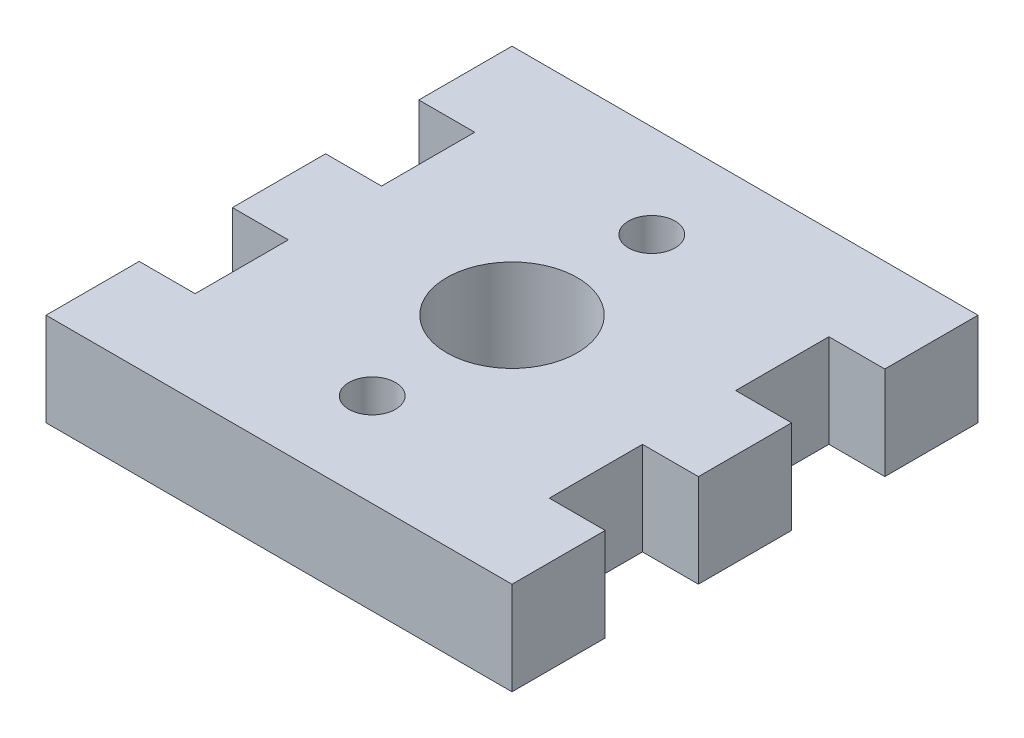
ISO-10303-21;
HEADER;
FILE_DESCRIPTION(('STEP AP214'),'2;1');
FILE_NAME('part.step','',(''),(''),'','','');
FILE_SCHEMA(('AUTOMOTIVE_DESIGN { 1 0 10303 214 1 1 1 1 }'));
ENDSEC;
DATA;
#1=APPLICATION_CONTEXT('core data for automotive mechanical design processes');
#2=APPLICATION_PROTOCOL_DEFINITION('international standard','automotive_design',2000,#1);
#3=PRODUCT_CONTEXT('',#1,'mechanical');
#4=PRODUCT('Part','Part','',(#3));
#5=PRODUCT_RELATED_PRODUCT_CATEGORY('part','',(#4));
#6=PRODUCT_DEFINITION_FORMATION('','',#4);
#7=PRODUCT_DEFINITION_CONTEXT('part definition',#1,'design');
#8=PRODUCT_DEFINITION('design','',#6,#7);
#9=PRODUCT_DEFINITION_SHAPE('','',#8);
#10=(LENGTH_UNIT() NAMED_UNIT(*) SI_UNIT(.MILLI.,.METRE.));
#11=(NAMED_UNIT(*) PLANE_ANGLE_UNIT() SI_UNIT($,.RADIAN.));
#12=(NAMED_UNIT(*) SI_UNIT($,.STERADIAN.) SOLID_ANGLE_UNIT());
#13=UNCERTAINTY_MEASURE_WITH_UNIT(LENGTH_MEASURE(1.E-05),#10,'distance_accuracy_value','');
#14=(GEOMETRIC_REPRESENTATION_CONTEXT(3) GLOBAL_UNCERTAINTY_ASSIGNED_CONTEXT((#13)) GLOBAL_UNIT_ASSIGNED_CONTEXT((#10,
#11,#12)) REPRESENTATION_CONTEXT('',''));
#15=CARTESIAN_POINT('',(0.,0.,0.));
#16=DIRECTION('',(0.,0.,1.));
#17=DIRECTION('',(1.,0.,0.));
#18=AXIS2_PLACEMENT_3D('',#15,#16,#17);
#19=CARTESIAN_POINT('',(0.,5.,0.));
#20=DIRECTION('',(0.,-1.,0.));
#21=DIRECTION('',(0.,0.,-1.));
#22=AXIS2_PLACEMENT_3D('',#19,#20,#21);
#23=PLANE('',#22);
#24=CARTESIAN_POINT('',(1.34297520661155,5.,-5.64049586776859));
#25=DIRECTION('',(0.,1.,0.));
#26=DIRECTION('',(0.,0.,1.));
#27=AXIS2_PLACEMENT_3D('',#24,#25,#26);
#28=CIRCLE('',#27,1.25);
#29=CARTESIAN_POINT('',(1.34297520661155,5.,-4.39049586776859));
#30=VERTEX_POINT('',#29);
#31=EDGE_CURVE('E501',#30,#30,#28,.T.);
#32=ORIENTED_EDGE('',*,*,#31,.F.);
#33=EDGE_LOOP('',(#32));
#34=FACE_BOUND('',#33,.T.);
#35=CARTESIAN_POINT('',(1.34297520661155,5.,9.35950413223141));
#36=DIRECTION('',(0.,1.,0.));
#37=DIRECTION('',(0.,0.,1.));
#38=AXIS2_PLACEMENT_3D('',#35,#36,#37);
#39=CIRCLE('',#38,1.25);
#40=CARTESIAN_POINT('',(1.34297520661155,5.,10.6095041322314));
#41=VERTEX_POINT('',#40);
#42=EDGE_CURVE('E493',#41,#41,#39,.T.);
#43=ORIENTED_EDGE('',*,*,#42,.F.);
#44=EDGE_LOOP('',(#43));
#45=FACE_BOUND('',#44,.T.);
#46=CARTESIAN_POINT('',(1.34297520661155,5.,1.85950413223141));
#47=DIRECTION('',(0.,1.,0.));
#48=DIRECTION('',(0.,0.,1.));
#49=AXIS2_PLACEMENT_3D('',#46,#47,#48);
#50=CIRCLE('',#49,3.5);
#51=CARTESIAN_POINT('',(1.34297520661155,5.,5.35950413223141));
#52=VERTEX_POINT('',#51);
#53=EDGE_CURVE('E384',#52,#52,#50,.T.);
#54=ORIENTED_EDGE('',*,*,#53,.F.);
#55=EDGE_LOOP('',(#54));
#56=FACE_BOUND('',#55,.T.);
#57=DIRECTION('',(-1.,0.,0.));
#58=VECTOR('',#57,1.);
#59=CARTESIAN_POINT('',(13.8429752066116,5.,-0.640495867768589));
#60=LINE('',#59,#58);
#61=CARTESIAN_POINT('',(13.8429752066116,5.,-0.640495867768589));
#62=VERTEX_POINT('',#61);
#63=CARTESIAN_POINT('',(10.8429752066116,5.,-0.640495867768589));
#64=VERTEX_POINT('',#63);
#65=EDGE_CURVE('E314',#62,#64,#60,.T.);
#66=ORIENTED_EDGE('',*,*,#65,.T.);
#67=DIRECTION('',(0.,0.,1.));
#68=VECTOR('',#67,1.);
#69=CARTESIAN_POINT('',(10.8429752066116,5.,-5.64049586776859));
#70=LINE('',#69,#68);
#71=CARTESIAN_POINT('',(10.8429752066116,5.,-5.64049586776859));
#72=VERTEX_POINT('',#71);
#73=EDGE_CURVE('E336',#72,#64,#70,.T.);
#74=ORIENTED_EDGE('',*,*,#73,.F.);
#75=DIRECTION('',(-1.,0.,0.));
#76=VECTOR('',#75,1.);
#77=CARTESIAN_POINT('',(13.8429752066116,5.,-5.64049586776859));
#78=LINE('',#77,#76);
#79=CARTESIAN_POINT('',(13.8429752066116,5.,-5.64049586776859));
#80=VERTEX_POINT('',#79);
#81=EDGE_CURVE('E332',#80,#72,#78,.T.);
#82=ORIENTED_EDGE('',*,*,#81,.F.);
#83=DIRECTION('',(0.,0.,-1.));
#84=VECTOR('',#83,1.);
#85=CARTESIAN_POINT('',(13.8429752066116,5.,14.3595041322314));
#86=LINE('',#85,#84);
#87=CARTESIAN_POINT('',(13.8429752066116,5.,-10.6404958677686));
#88=VERTEX_POINT('',#87);
#89=EDGE_CURVE('E216',#80,#88,#86,.T.);
#90=ORIENTED_EDGE('',*,*,#89,.T.);
#91=DIRECTION('',(-1.,0.,0.));
#92=VECTOR('',#91,1.);
#93=CARTESIAN_POINT('',(-11.1570247933884,5.,-10.6404958677686));
#94=LINE('',#93,#92);
#95=CARTESIAN_POINT('',(-11.1570247933884,5.,-10.6404958677686));
#96=VERTEX_POINT('',#95);
#97=EDGE_CURVE('E225',#88,#96,#94,.T.);
#98=ORIENTED_EDGE('',*,*,#97,.T.);
#99=DIRECTION('',(0.,0.,1.));
#100=VECTOR('',#99,1.);
#101=CARTESIAN_POINT('',(-11.1570247933884,5.,14.3595041322314));
#102=LINE('',#101,#100);
#103=CARTESIAN_POINT('',(-11.1570247933884,5.,-5.64049586776859));
#104=VERTEX_POINT('',#103);
#105=EDGE_CURVE('E203',#96,#104,#102,.T.);
#106=ORIENTED_EDGE('',*,*,#105,.T.);
#107=DIRECTION('',(1.,0.,0.));
#108=VECTOR('',#107,1.);
#109=CARTESIAN_POINT('',(-11.1570247933884,5.,-5.64049586776859));
#110=LINE('',#109,#108);
#111=CARTESIAN_POINT('',(-8.15702479338845,5.,-5.64049586776859));
#112=VERTEX_POINT('',#111);
#113=EDGE_CURVE('E54',#104,#112,#110,.T.);
#114=ORIENTED_EDGE('',*,*,#113,.T.);
#115=DIRECTION('',(0.,0.,1.));
#116=VECTOR('',#115,1.);
#117=CARTESIAN_POINT('',(-8.15702479338845,5.,-5.64049586776859));
#118=LINE('',#117,#116);
#119=CARTESIAN_POINT('',(-8.15702479338845,5.,-0.640495867768589));
#120=VERTEX_POINT('',#119);
#121=EDGE_CURVE('E346',#112,#120,#118,.T.);
#122=ORIENTED_EDGE('',*,*,#121,.T.);
#123=DIRECTION('',(1.,0.,0.));
#124=VECTOR('',#123,1.);
#125=CARTESIAN_POINT('',(-11.1570247933884,5.,-0.640495867768589));
#126=LINE('',#125,#124);
#127=CARTESIAN_POINT('',(-11.1570247933884,5.,-0.640495867768589));
#128=VERTEX_POINT('',#127);
#129=EDGE_CURVE('E342',#128,#120,#126,.T.);
#130=ORIENTED_EDGE('',*,*,#129,.F.);
#131=CARTESIAN_POINT('',(-11.1570247933884,5.,4.35950413223141));
#132=VERTEX_POINT('',#131);
#133=EDGE_CURVE('E200',#128,#132,#102,.T.);
#134=ORIENTED_EDGE('',*,*,#133,.T.);
#135=DIRECTION('',(1.,0.,0.));
#136=VECTOR('',#135,1.);
#137=CARTESIAN_POINT('',(-11.1570247933884,5.,4.35950413223141));
#138=LINE('',#137,#136);
#139=CARTESIAN_POINT('',(-8.15702479338845,5.,4.35950413223141));
#140=VERTEX_POINT('',#139);
#141=EDGE_CURVE('E347',#132,#140,#138,.T.);
#142=ORIENTED_EDGE('',*,*,#141,.T.);
#143=DIRECTION('',(0.,0.,-1.));
#144=VECTOR('',#143,1.);
#145=CARTESIAN_POINT('',(-8.15702479338845,5.,9.35950413223141));
#146=LINE('',#145,#144);
#147=CARTESIAN_POINT('',(-8.15702479338845,5.,9.35950413223141));
#148=VERTEX_POINT('',#147);
#149=EDGE_CURVE('E192',#148,#140,#146,.T.);
#150=ORIENTED_EDGE('',*,*,#149,.F.);
#151=DIRECTION('',(1.,0.,0.));
#152=VECTOR('',#151,1.);
#153=CARTESIAN_POINT('',(-11.1570247933884,5.,9.35950413223141));
#154=LINE('',#153,#152);
#155=CARTESIAN_POINT('',(-11.1570247933884,5.,9.35950413223141));
#156=VERTEX_POINT('',#155);
#157=EDGE_CURVE('E177',#156,#148,#154,.T.);
#158=ORIENTED_EDGE('',*,*,#157,.F.);
#159=CARTESIAN_POINT('',(-11.1570247933884,5.,14.3595041322314));
#160=VERTEX_POINT('',#159);
#161=EDGE_CURVE('E188',#156,#160,#102,.T.);
#162=ORIENTED_EDGE('',*,*,#161,.T.);
#163=DIRECTION('',(1.,0.,0.));
#164=VECTOR('',#163,1.);
#165=CARTESIAN_POINT('',(-11.1570247933884,5.,14.3595041322314));
#166=LINE('',#165,#164);
#167=CARTESIAN_POINT('',(13.8429752066116,5.,14.3595041322314));
#168=VERTEX_POINT('',#167);
#169=EDGE_CURVE('E213',#160,#168,#166,.T.);
#170=ORIENTED_EDGE('',*,*,#169,.T.);
#171=CARTESIAN_POINT('',(13.8429752066116,5.,9.35950413223141));
#172=VERTEX_POINT('',#171);
#173=EDGE_CURVE('E222',#168,#172,#86,.T.);
#174=ORIENTED_EDGE('',*,*,#173,.T.);
#175=DIRECTION('',(-1.,0.,0.));
#176=VECTOR('',#175,1.);
#177=CARTESIAN_POINT('',(13.8429752066116,5.,9.35950413223141));
#178=LINE('',#177,#176);
#179=CARTESIAN_POINT('',(10.8429752066116,5.,9.35950413223141));
#180=VERTEX_POINT('',#179);
#181=EDGE_CURVE('E320',#172,#180,#178,.T.);
#182=ORIENTED_EDGE('',*,*,#181,.T.);
#183=DIRECTION('',(0.,0.,-1.));
#184=VECTOR('',#183,1.);
#185=CARTESIAN_POINT('',(10.8429752066116,5.,9.35950413223141));
#186=LINE('',#185,#184);
#187=CARTESIAN_POINT('',(10.8429752066116,5.,4.35950413223141));
#188=VERTEX_POINT('',#187);
#189=EDGE_CURVE('E312',#180,#188,#186,.T.);
#190=ORIENTED_EDGE('',*,*,#189,.T.);
#191=DIRECTION('',(-1.,0.,0.));
#192=VECTOR('',#191,1.);
#193=CARTESIAN_POINT('',(13.8429752066116,5.,4.35950413223141));
#194=LINE('',#193,#192);
#195=CARTESIAN_POINT('',(13.8429752066116,5.,4.35950413223141));
#196=VERTEX_POINT('',#195);
#197=EDGE_CURVE('E306',#196,#188,#194,.T.);
#198=ORIENTED_EDGE('',*,*,#197,.F.);
#199=EDGE_CURVE('E220',#196,#62,#86,.T.);
#200=ORIENTED_EDGE('',*,*,#199,.T.);
#201=EDGE_LOOP('',(#66,#74,#82,#90,#98,#106,#114,#122,#130,#134,#142,#150,#158,#162,#170,#174,
#182,#190,#198,#200));
#202=FACE_BOUND('',#201,.T.);
#203=ADVANCED_FACE('F38',(#34,#45,#56,#202),#23,.F.);
#204=CARTESIAN_POINT('',(0.,0.,0.));
#205=DIRECTION('',(0.,-1.,0.));
#206=DIRECTION('',(0.,0.,-1.));
#207=AXIS2_PLACEMENT_3D('',#204,#205,#206);
#208=PLANE('',#207);
#209=CARTESIAN_POINT('',(1.34297520661155,0.,-5.64049586776859));
#210=DIRECTION('',(0.,1.,0.));
#211=DIRECTION('',(0.,0.,1.));
#212=AXIS2_PLACEMENT_3D('',#209,#210,#211);
#213=CIRCLE('',#212,1.25);
#214=CARTESIAN_POINT('',(1.34297520661155,0.,-4.39049586776859));
#215=VERTEX_POINT('',#214);
#216=EDGE_CURVE('E329',#215,#215,#213,.T.);
#217=ORIENTED_EDGE('',*,*,#216,.T.);
#218=EDGE_LOOP('',(#217));
#219=FACE_BOUND('',#218,.T.);
#220=CARTESIAN_POINT('',(1.34297520661155,0.,9.35950413223141));
#221=DIRECTION('',(0.,1.,0.));
#222=DIRECTION('',(0.,0.,1.));
#223=AXIS2_PLACEMENT_3D('',#220,#221,#222);
#224=CIRCLE('',#223,1.25);
#225=CARTESIAN_POINT('',(1.34297520661155,0.,10.6095041322314));
#226=VERTEX_POINT('',#225);
#227=EDGE_CURVE('E497',#226,#226,#224,.T.);
#228=ORIENTED_EDGE('',*,*,#227,.T.);
#229=EDGE_LOOP('',(#228));
#230=FACE_BOUND('',#229,.T.);
#231=CARTESIAN_POINT('',(1.34297520661155,0.,1.85950413223141));
#232=DIRECTION('',(0.,1.,0.));
#233=DIRECTION('',(0.,0.,1.));
#234=AXIS2_PLACEMENT_3D('',#231,#232,#233);
#235=CIRCLE('',#234,3.5);
#236=CARTESIAN_POINT('',(1.34297520661155,0.,5.35950413223141));
#237=VERTEX_POINT('',#236);
#238=EDGE_CURVE('E383',#237,#237,#235,.T.);
#239=ORIENTED_EDGE('',*,*,#238,.T.);
#240=EDGE_LOOP('',(#239));
#241=FACE_BOUND('',#240,.T.);
#242=DIRECTION('',(0.,0.,-1.));
#243=VECTOR('',#242,1.);
#244=CARTESIAN_POINT('',(10.8429752066116,0.,0.));
#245=LINE('',#244,#243);
#246=CARTESIAN_POINT('',(10.8429752066116,0.,-0.640495867768589));
#247=VERTEX_POINT('',#246);
#248=CARTESIAN_POINT('',(10.8429752066116,0.,-5.64049586776859));
#249=VERTEX_POINT('',#248);
#250=EDGE_CURVE('E11',#247,#249,#245,.T.);
#251=ORIENTED_EDGE('',*,*,#250,.F.);
#252=DIRECTION('',(1.,0.,0.));
#253=VECTOR('',#252,1.);
#254=CARTESIAN_POINT('',(0.,0.,-0.640495867768589));
#255=LINE('',#254,#253);
#256=CARTESIAN_POINT('',(13.8429752066116,0.,-0.640495867768589));
#257=VERTEX_POINT('',#256);
#258=EDGE_CURVE('E366',#247,#257,#255,.T.);
#259=ORIENTED_EDGE('',*,*,#258,.T.);
#260=DIRECTION('',(0.,0.,-1.));
#261=VECTOR('',#260,1.);
#262=CARTESIAN_POINT('',(13.8429752066116,0.,14.3595041322314));
#263=LINE('',#262,#261);
#264=CARTESIAN_POINT('',(13.8429752066116,0.,4.35950413223141));
#265=VERTEX_POINT('',#264);
#266=EDGE_CURVE('E241',#265,#257,#263,.T.);
#267=ORIENTED_EDGE('',*,*,#266,.F.);
#268=DIRECTION('',(1.,0.,0.));
#269=VECTOR('',#268,1.);
#270=CARTESIAN_POINT('',(0.,0.,4.35950413223141));
#271=LINE('',#270,#269);
#272=CARTESIAN_POINT('',(10.8429752066116,0.,4.35950413223141));
#273=VERTEX_POINT('',#272);
#274=EDGE_CURVE('E294',#273,#265,#271,.T.);
#275=ORIENTED_EDGE('',*,*,#274,.F.);
#276=DIRECTION('',(0.,0.,1.));
#277=VECTOR('',#276,1.);
#278=CARTESIAN_POINT('',(10.8429752066116,0.,0.));
#279=LINE('',#278,#277);
#280=CARTESIAN_POINT('',(10.8429752066116,0.,9.35950413223141));
#281=VERTEX_POINT('',#280);
#282=EDGE_CURVE('E47',#273,#281,#279,.T.);
#283=ORIENTED_EDGE('',*,*,#282,.T.);
#284=DIRECTION('',(1.,0.,0.));
#285=VECTOR('',#284,1.);
#286=CARTESIAN_POINT('',(0.,0.,9.35950413223141));
#287=LINE('',#286,#285);
#288=CARTESIAN_POINT('',(13.8429752066116,0.,9.35950413223141));
#289=VERTEX_POINT('',#288);
#290=EDGE_CURVE('E292',#281,#289,#287,.T.);
#291=ORIENTED_EDGE('',*,*,#290,.T.);
#292=CARTESIAN_POINT('',(13.8429752066116,0.,14.3595041322314));
#293=VERTEX_POINT('',#292);
#294=EDGE_CURVE('E207',#293,#289,#263,.T.);
#295=ORIENTED_EDGE('',*,*,#294,.F.);
#296=DIRECTION('',(1.,0.,0.));
#297=VECTOR('',#296,1.);
#298=CARTESIAN_POINT('',(-11.1570247933884,0.,14.3595041322314));
#299=LINE('',#298,#297);
#300=CARTESIAN_POINT('',(-11.1570247933884,0.,14.3595041322314));
#301=VERTEX_POINT('',#300);
#302=EDGE_CURVE('E233',#301,#293,#299,.T.);
#303=ORIENTED_EDGE('',*,*,#302,.F.);
#304=DIRECTION('',(0.,0.,1.));
#305=VECTOR('',#304,1.);
#306=CARTESIAN_POINT('',(-11.1570247933884,0.,14.3595041322314));
#307=LINE('',#306,#305);
#308=CARTESIAN_POINT('',(-11.1570247933884,0.,9.35950413223141));
#309=VERTEX_POINT('',#308);
#310=EDGE_CURVE('E235',#309,#301,#307,.T.);
#311=ORIENTED_EDGE('',*,*,#310,.F.);
#312=DIRECTION('',(-1.,0.,0.));
#313=VECTOR('',#312,1.);
#314=CARTESIAN_POINT('',(0.,0.,9.35950413223141));
#315=LINE('',#314,#313);
#316=CARTESIAN_POINT('',(-8.15702479338845,0.,9.35950413223141));
#317=VERTEX_POINT('',#316);
#318=EDGE_CURVE('E62',#317,#309,#315,.T.);
#319=ORIENTED_EDGE('',*,*,#318,.F.);
#320=DIRECTION('',(0.,0.,1.));
#321=VECTOR('',#320,1.);
#322=CARTESIAN_POINT('',(-8.15702479338845,0.,0.));
#323=LINE('',#322,#321);
#324=CARTESIAN_POINT('',(-8.15702479338845,0.,4.35950413223141));
#325=VERTEX_POINT('',#324);
#326=EDGE_CURVE('E282',#325,#317,#323,.T.);
#327=ORIENTED_EDGE('',*,*,#326,.F.);
#328=DIRECTION('',(-1.,0.,0.));
#329=VECTOR('',#328,1.);
#330=CARTESIAN_POINT('',(0.,0.,4.35950413223141));
#331=LINE('',#330,#329);
#332=CARTESIAN_POINT('',(-11.1570247933884,0.,4.35950413223141));
#333=VERTEX_POINT('',#332);
#334=EDGE_CURVE('E379',#325,#333,#331,.T.);
#335=ORIENTED_EDGE('',*,*,#334,.T.);
#336=CARTESIAN_POINT('',(-11.1570247933884,0.,-0.640495867768589));
#337=VERTEX_POINT('',#336);
#338=EDGE_CURVE('E234',#337,#333,#307,.T.);
#339=ORIENTED_EDGE('',*,*,#338,.F.);
#340=DIRECTION('',(-1.,0.,0.));
#341=VECTOR('',#340,1.);
#342=CARTESIAN_POINT('',(0.,0.,-0.640495867768589));
#343=LINE('',#342,#341);
#344=CARTESIAN_POINT('',(-8.15702479338845,0.,-0.640495867768589));
#345=VERTEX_POINT('',#344);
#346=EDGE_CURVE('E374',#345,#337,#343,.T.);
#347=ORIENTED_EDGE('',*,*,#346,.F.);
#348=DIRECTION('',(0.,0.,-1.));
#349=VECTOR('',#348,1.);
#350=CARTESIAN_POINT('',(-8.15702479338845,0.,0.));
#351=LINE('',#350,#349);
#352=CARTESIAN_POINT('',(-8.15702479338845,0.,-5.64049586776859));
#353=VERTEX_POINT('',#352);
#354=EDGE_CURVE('E278',#345,#353,#351,.T.);
#355=ORIENTED_EDGE('',*,*,#354,.T.);
#356=DIRECTION('',(-1.,0.,0.));
#357=VECTOR('',#356,1.);
#358=CARTESIAN_POINT('',(0.,0.,-5.64049586776859));
#359=LINE('',#358,#357);
#360=CARTESIAN_POINT('',(-11.1570247933884,0.,-5.64049586776859));
#361=VERTEX_POINT('',#360);
#362=EDGE_CURVE('E370',#353,#361,#359,.T.);
#363=ORIENTED_EDGE('',*,*,#362,.T.);
#364=CARTESIAN_POINT('',(-11.1570247933884,0.,-10.6404958677686));
#365=VERTEX_POINT('',#364);
#366=EDGE_CURVE('E229',#365,#361,#307,.T.);
#367=ORIENTED_EDGE('',*,*,#366,.F.);
#368=DIRECTION('',(-1.,0.,0.));
#369=VECTOR('',#368,1.);
#370=CARTESIAN_POINT('',(-11.1570247933884,0.,-10.6404958677686));
#371=LINE('',#370,#369);
#372=CARTESIAN_POINT('',(13.8429752066116,0.,-10.6404958677686));
#373=VERTEX_POINT('',#372);
#374=EDGE_CURVE('E201',#373,#365,#371,.T.);
#375=ORIENTED_EDGE('',*,*,#374,.F.);
#376=CARTESIAN_POINT('',(13.8429752066116,0.,-5.64049586776859));
#377=VERTEX_POINT('',#376);
#378=EDGE_CURVE('E238',#377,#373,#263,.T.);
#379=ORIENTED_EDGE('',*,*,#378,.F.);
#380=DIRECTION('',(1.,0.,0.));
#381=VECTOR('',#380,1.);
#382=CARTESIAN_POINT('',(0.,0.,-5.64049586776859));
#383=LINE('',#382,#381);
#384=EDGE_CURVE('E363',#249,#377,#383,.T.);
#385=ORIENTED_EDGE('',*,*,#384,.F.);
#386=EDGE_LOOP('',(#251,#259,#267,#275,#283,#291,#295,#303,#311,#319,#327,#335,#339,#347,#355,
#363,#367,#375,#379,#385));
#387=FACE_BOUND('',#386,.T.);
#388=ADVANCED_FACE('F290',(#219,#230,#241,#387),#208,.T.);
#389=CARTESIAN_POINT('',(-11.1570247933884,5.,14.3595041322314));
#390=DIRECTION('',(1.,0.,0.));
#391=DIRECTION('',(0.,0.,-1.));
#392=AXIS2_PLACEMENT_3D('',#389,#390,#391);
#393=PLANE('',#392);
#394=DIRECTION('',(0.,-1.,0.));
#395=VECTOR('',#394,1.);
#396=CARTESIAN_POINT('',(-11.1570247933884,5.,4.35950413223141));
#397=LINE('',#396,#395);
#398=EDGE_CURVE('E183',#132,#333,#397,.T.);
#399=ORIENTED_EDGE('',*,*,#398,.F.);
#400=ORIENTED_EDGE('',*,*,#133,.F.);
#401=DIRECTION('',(0.,-1.,0.));
#402=VECTOR('',#401,1.);
#403=CARTESIAN_POINT('',(-11.1570247933884,5.,-0.640495867768589));
#404=LINE('',#403,#402);
#405=EDGE_CURVE('E184',#128,#337,#404,.T.);
#406=ORIENTED_EDGE('',*,*,#405,.T.);
#407=ORIENTED_EDGE('',*,*,#338,.T.);
#408=EDGE_LOOP('',(#399,#400,#406,#407));
#409=FACE_BOUND('',#408,.T.);
#410=ADVANCED_FACE('F416',(#409),#393,.F.);
#411=DIRECTION('',(0.,-1.,0.));
#412=VECTOR('',#411,1.);
#413=CARTESIAN_POINT('',(-11.1570247933884,5.,-5.64049586776859));
#414=LINE('',#413,#412);
#415=EDGE_CURVE('E270',#104,#361,#414,.T.);
#416=ORIENTED_EDGE('',*,*,#415,.F.);
#417=ORIENTED_EDGE('',*,*,#105,.F.);
#418=DIRECTION('',(0.,-1.,0.));
#419=VECTOR('',#418,1.);
#420=CARTESIAN_POINT('',(-11.1570247933884,5.,-10.6404958677686));
#421=LINE('',#420,#419);
#422=EDGE_CURVE('E228',#96,#365,#421,.T.);
#423=ORIENTED_EDGE('',*,*,#422,.T.);
#424=ORIENTED_EDGE('',*,*,#366,.T.);
#425=EDGE_LOOP('',(#416,#417,#423,#424));
#426=FACE_BOUND('',#425,.T.);
#427=ADVANCED_FACE('F434',(#426),#393,.F.);
#428=CARTESIAN_POINT('',(13.8429752066116,5.,14.3595041322314));
#429=DIRECTION('',(-1.,0.,0.));
#430=DIRECTION('',(0.,0.,1.));
#431=AXIS2_PLACEMENT_3D('',#428,#429,#430);
#432=PLANE('',#431);
#433=DIRECTION('',(0.,-1.,0.));
#434=VECTOR('',#433,1.);
#435=CARTESIAN_POINT('',(13.8429752066116,5.,-0.640495867768589));
#436=LINE('',#435,#434);
#437=EDGE_CURVE('E267',#62,#257,#436,.T.);
#438=ORIENTED_EDGE('',*,*,#437,.F.);
#439=ORIENTED_EDGE('',*,*,#199,.F.);
#440=DIRECTION('',(0.,-1.,0.));
#441=VECTOR('',#440,1.);
#442=CARTESIAN_POINT('',(13.8429752066116,5.,4.35950413223141));
#443=LINE('',#442,#441);
#444=EDGE_CURVE('E256',#196,#265,#443,.T.);
#445=ORIENTED_EDGE('',*,*,#444,.T.);
#446=ORIENTED_EDGE('',*,*,#266,.T.);
#447=EDGE_LOOP('',(#438,#439,#445,#446));
#448=FACE_BOUND('',#447,.T.);
#449=ADVANCED_FACE('F425',(#448),#432,.F.);
#450=DIRECTION('',(0.,-1.,0.));
#451=VECTOR('',#450,1.);
#452=CARTESIAN_POINT('',(13.8429752066116,5.,9.35950413223141));
#453=LINE('',#452,#451);
#454=EDGE_CURVE('E260',#172,#289,#453,.T.);
#455=ORIENTED_EDGE('',*,*,#454,.F.);
#456=ORIENTED_EDGE('',*,*,#173,.F.);
#457=DIRECTION('',(0.,-1.,0.));
#458=VECTOR('',#457,1.);
#459=CARTESIAN_POINT('',(13.8429752066116,5.,14.3595041322314));
#460=LINE('',#459,#458);
#461=EDGE_CURVE('E250',#168,#293,#460,.T.);
#462=ORIENTED_EDGE('',*,*,#461,.T.);
#463=ORIENTED_EDGE('',*,*,#294,.T.);
#464=EDGE_LOOP('',(#455,#456,#462,#463));
#465=FACE_BOUND('',#464,.T.);
#466=ADVANCED_FACE('F426',(#465),#432,.F.);
#467=ORIENTED_EDGE('',*,*,#161,.F.);
#468=DIRECTION('',(0.,-1.,0.));
#469=VECTOR('',#468,1.);
#470=CARTESIAN_POINT('',(-11.1570247933884,5.,9.35950413223141));
#471=LINE('',#470,#469);
#472=EDGE_CURVE('E174',#156,#309,#471,.T.);
#473=ORIENTED_EDGE('',*,*,#472,.T.);
#474=ORIENTED_EDGE('',*,*,#310,.T.);
#475=DIRECTION('',(0.,-1.,0.));
#476=VECTOR('',#475,1.);
#477=CARTESIAN_POINT('',(-11.1570247933884,5.,14.3595041322314));
#478=LINE('',#477,#476);
#479=EDGE_CURVE('E198',#160,#301,#478,.T.);
#480=ORIENTED_EDGE('',*,*,#479,.F.);
#481=EDGE_LOOP('',(#467,#473,#474,#480));
#482=FACE_BOUND('',#481,.T.);
#483=ADVANCED_FACE('F40',(#482),#393,.F.);
#484=CARTESIAN_POINT('',(-11.1570247933884,5.,14.3595041322314));
#485=DIRECTION('',(0.,0.,-1.));
#486=DIRECTION('',(-1.,0.,0.));
#487=AXIS2_PLACEMENT_3D('',#484,#485,#486);
#488=PLANE('',#487);
#489=ORIENTED_EDGE('',*,*,#302,.T.);
#490=ORIENTED_EDGE('',*,*,#461,.F.);
#491=ORIENTED_EDGE('',*,*,#169,.F.);
#492=ORIENTED_EDGE('',*,*,#479,.T.);
#493=EDGE_LOOP('',(#489,#490,#491,#492));
#494=FACE_BOUND('',#493,.T.);
#495=ADVANCED_FACE('F423',(#494),#488,.F.);
#496=ORIENTED_EDGE('',*,*,#89,.F.);
#497=DIRECTION('',(0.,-1.,0.));
#498=VECTOR('',#497,1.);
#499=CARTESIAN_POINT('',(13.8429752066116,5.,-5.64049586776859));
#500=LINE('',#499,#498);
#501=EDGE_CURVE('E263',#80,#377,#500,.T.);
#502=ORIENTED_EDGE('',*,*,#501,.T.);
#503=ORIENTED_EDGE('',*,*,#378,.T.);
#504=DIRECTION('',(0.,-1.,0.));
#505=VECTOR('',#504,1.);
#506=CARTESIAN_POINT('',(13.8429752066116,5.,-10.6404958677686));
#507=LINE('',#506,#505);
#508=EDGE_CURVE('E246',#88,#373,#507,.T.);
#509=ORIENTED_EDGE('',*,*,#508,.F.);
#510=EDGE_LOOP('',(#496,#502,#503,#509));
#511=FACE_BOUND('',#510,.T.);
#512=ADVANCED_FACE('F405',(#511),#432,.F.);
#513=CARTESIAN_POINT('',(-11.1570247933884,5.,-10.6404958677686));
#514=DIRECTION('',(0.,0.,1.));
#515=DIRECTION('',(1.,0.,0.));
#516=AXIS2_PLACEMENT_3D('',#513,#514,#515);
#517=PLANE('',#516);
#518=ORIENTED_EDGE('',*,*,#374,.T.);
#519=ORIENTED_EDGE('',*,*,#422,.F.);
#520=ORIENTED_EDGE('',*,*,#97,.F.);
#521=ORIENTED_EDGE('',*,*,#508,.T.);
#522=EDGE_LOOP('',(#518,#519,#520,#521));
#523=FACE_BOUND('',#522,.T.);
#524=ADVANCED_FACE('F395',(#523),#517,.F.);
#525=CARTESIAN_POINT('',(1.34297520661155,5.,1.85950413223141));
#526=DIRECTION('',(0.,-1.,0.));
#527=DIRECTION('',(0.,0.,-1.));
#528=AXIS2_PLACEMENT_3D('',#525,#526,#527);
#529=CYLINDRICAL_SURFACE('',#528,3.5);
#530=ORIENTED_EDGE('',*,*,#53,.T.);
#531=EDGE_LOOP('',(#530));
#532=FACE_BOUND('',#531,.T.);
#533=ORIENTED_EDGE('',*,*,#238,.F.);
#534=EDGE_LOOP('',(#533));
#535=FACE_BOUND('',#534,.T.);
#536=ADVANCED_FACE('F392',(#532,#535),#529,.F.);
#537=CARTESIAN_POINT('',(13.8429752066116,-10.,9.35950413223141));
#538=DIRECTION('',(0.,0.,-1.));
#539=DIRECTION('',(-1.,0.,0.));
#540=AXIS2_PLACEMENT_3D('',#537,#538,#539);
#541=PLANE('',#540);
#542=DIRECTION('',(0.,1.,0.));
#543=VECTOR('',#542,1.);
#544=CARTESIAN_POINT('',(10.8429752066116,-10.,9.35950413223141));
#545=LINE('',#544,#543);
#546=EDGE_CURVE('E302',#281,#180,#545,.T.);
#547=ORIENTED_EDGE('',*,*,#546,.T.);
#548=ORIENTED_EDGE('',*,*,#181,.F.);
#549=ORIENTED_EDGE('',*,*,#454,.T.);
#550=ORIENTED_EDGE('',*,*,#290,.F.);
#551=EDGE_LOOP('',(#547,#548,#549,#550));
#552=FACE_BOUND('',#551,.T.);
#553=ADVANCED_FACE('F394',(#552),#541,.T.);
#554=CARTESIAN_POINT('',(10.8429752066116,-10.,9.35950413223141));
#555=DIRECTION('',(1.,0.,0.));
#556=DIRECTION('',(0.,0.,-1.));
#557=AXIS2_PLACEMENT_3D('',#554,#555,#556);
#558=PLANE('',#557);
#559=DIRECTION('',(0.,1.,0.));
#560=VECTOR('',#559,1.);
#561=CARTESIAN_POINT('',(10.8429752066116,-10.,4.35950413223141));
#562=LINE('',#561,#560);
#563=EDGE_CURVE('E300',#273,#188,#562,.T.);
#564=ORIENTED_EDGE('',*,*,#563,.T.);
#565=ORIENTED_EDGE('',*,*,#189,.F.);
#566=ORIENTED_EDGE('',*,*,#546,.F.);
#567=ORIENTED_EDGE('',*,*,#282,.F.);
#568=EDGE_LOOP('',(#564,#565,#566,#567));
#569=FACE_BOUND('',#568,.T.);
#570=ADVANCED_FACE('F298',(#569),#558,.T.);
#571=CARTESIAN_POINT('',(13.8429752066116,-10.,4.35950413223141));
#572=DIRECTION('',(0.,0.,-1.));
#573=DIRECTION('',(-1.,0.,0.));
#574=AXIS2_PLACEMENT_3D('',#571,#572,#573);
#575=PLANE('',#574);
#576=ORIENTED_EDGE('',*,*,#274,.T.);
#577=ORIENTED_EDGE('',*,*,#444,.F.);
#578=ORIENTED_EDGE('',*,*,#197,.T.);
#579=ORIENTED_EDGE('',*,*,#563,.F.);
#580=EDGE_LOOP('',(#576,#577,#578,#579));
#581=FACE_BOUND('',#580,.T.);
#582=ADVANCED_FACE('F304',(#581),#575,.F.);
#583=CARTESIAN_POINT('',(13.8429752066116,-10.,-0.640495867768589));
#584=DIRECTION('',(0.,0.,-1.));
#585=DIRECTION('',(-1.,0.,0.));
#586=AXIS2_PLACEMENT_3D('',#583,#584,#585);
#587=PLANE('',#586);
#588=DIRECTION('',(0.,1.,0.));
#589=VECTOR('',#588,1.);
#590=CARTESIAN_POINT('',(10.8429752066116,-10.,-0.640495867768589));
#591=LINE('',#590,#589);
#592=EDGE_CURVE('E325',#247,#64,#591,.T.);
#593=ORIENTED_EDGE('',*,*,#592,.T.);
#594=ORIENTED_EDGE('',*,*,#65,.F.);
#595=ORIENTED_EDGE('',*,*,#437,.T.);
#596=ORIENTED_EDGE('',*,*,#258,.F.);
#597=EDGE_LOOP('',(#593,#594,#595,#596));
#598=FACE_BOUND('',#597,.T.);
#599=ADVANCED_FACE('F446',(#598),#587,.T.);
#600=CARTESIAN_POINT('',(10.8429752066116,-10.,-5.64049586776859));
#601=DIRECTION('',(-1.,0.,0.));
#602=DIRECTION('',(0.,0.,1.));
#603=AXIS2_PLACEMENT_3D('',#600,#601,#602);
#604=PLANE('',#603);
#605=ORIENTED_EDGE('',*,*,#250,.T.);
#606=DIRECTION('',(0.,1.,0.));
#607=VECTOR('',#606,1.);
#608=CARTESIAN_POINT('',(10.8429752066116,-10.,-5.64049586776859));
#609=LINE('',#608,#607);
#610=EDGE_CURVE('E328',#249,#72,#609,.T.);
#611=ORIENTED_EDGE('',*,*,#610,.T.);
#612=ORIENTED_EDGE('',*,*,#73,.T.);
#613=ORIENTED_EDGE('',*,*,#592,.F.);
#614=EDGE_LOOP('',(#605,#611,#612,#613));
#615=FACE_BOUND('',#614,.T.);
#616=ADVANCED_FACE('F452',(#615),#604,.F.);
#617=CARTESIAN_POINT('',(13.8429752066116,-10.,-5.64049586776859));
#618=DIRECTION('',(0.,0.,-1.));
#619=DIRECTION('',(-1.,0.,0.));
#620=AXIS2_PLACEMENT_3D('',#617,#618,#619);
#621=PLANE('',#620);
#622=ORIENTED_EDGE('',*,*,#384,.T.);
#623=ORIENTED_EDGE('',*,*,#501,.F.);
#624=ORIENTED_EDGE('',*,*,#81,.T.);
#625=ORIENTED_EDGE('',*,*,#610,.F.);
#626=EDGE_LOOP('',(#622,#623,#624,#625));
#627=FACE_BOUND('',#626,.T.);
#628=ADVANCED_FACE('F454',(#627),#621,.F.);
#629=CARTESIAN_POINT('',(-11.1570247933884,-10.,-0.640495867768589));
#630=DIRECTION('',(0.,0.,1.));
#631=DIRECTION('',(1.,0.,0.));
#632=AXIS2_PLACEMENT_3D('',#629,#630,#631);
#633=PLANE('',#632);
#634=ORIENTED_EDGE('',*,*,#346,.T.);
#635=ORIENTED_EDGE('',*,*,#405,.F.);
#636=ORIENTED_EDGE('',*,*,#129,.T.);
#637=DIRECTION('',(0.,1.,0.));
#638=VECTOR('',#637,1.);
#639=CARTESIAN_POINT('',(-8.15702479338845,-10.,-0.640495867768589));
#640=LINE('',#639,#638);
#641=EDGE_CURVE('E353',#345,#120,#640,.T.);
#642=ORIENTED_EDGE('',*,*,#641,.F.);
#643=EDGE_LOOP('',(#634,#635,#636,#642));
#644=FACE_BOUND('',#643,.T.);
#645=ADVANCED_FACE('F473',(#644),#633,.F.);
#646=CARTESIAN_POINT('',(-11.1570247933884,-10.,-5.64049586776859));
#647=DIRECTION('',(0.,0.,1.));
#648=DIRECTION('',(1.,0.,0.));
#649=AXIS2_PLACEMENT_3D('',#646,#647,#648);
#650=PLANE('',#649);
#651=DIRECTION('',(0.,1.,0.));
#652=VECTOR('',#651,1.);
#653=CARTESIAN_POINT('',(-8.15702479338845,-10.,-5.64049586776859));
#654=LINE('',#653,#652);
#655=EDGE_CURVE('E354',#353,#112,#654,.T.);
#656=ORIENTED_EDGE('',*,*,#655,.T.);
#657=ORIENTED_EDGE('',*,*,#113,.F.);
#658=ORIENTED_EDGE('',*,*,#415,.T.);
#659=ORIENTED_EDGE('',*,*,#362,.F.);
#660=EDGE_LOOP('',(#656,#657,#658,#659));
#661=FACE_BOUND('',#660,.T.);
#662=ADVANCED_FACE('F464',(#661),#650,.T.);
#663=CARTESIAN_POINT('',(-8.15702479338845,-10.,-5.64049586776859));
#664=DIRECTION('',(-1.,0.,0.));
#665=DIRECTION('',(0.,0.,1.));
#666=AXIS2_PLACEMENT_3D('',#663,#664,#665);
#667=PLANE('',#666);
#668=ORIENTED_EDGE('',*,*,#641,.T.);
#669=ORIENTED_EDGE('',*,*,#121,.F.);
#670=ORIENTED_EDGE('',*,*,#655,.F.);
#671=ORIENTED_EDGE('',*,*,#354,.F.);
#672=EDGE_LOOP('',(#668,#669,#670,#671));
#673=FACE_BOUND('',#672,.T.);
#674=ADVANCED_FACE('F470',(#673),#667,.T.);
#675=CARTESIAN_POINT('',(-11.1570247933884,-10.,4.35950413223141));
#676=DIRECTION('',(0.,0.,1.));
#677=DIRECTION('',(1.,0.,0.));
#678=AXIS2_PLACEMENT_3D('',#675,#676,#677);
#679=PLANE('',#678);
#680=DIRECTION('',(0.,1.,0.));
#681=VECTOR('',#680,1.);
#682=CARTESIAN_POINT('',(-8.15702479338845,-10.,4.35950413223141));
#683=LINE('',#682,#681);
#684=EDGE_CURVE('E324',#325,#140,#683,.T.);
#685=ORIENTED_EDGE('',*,*,#684,.T.);
#686=ORIENTED_EDGE('',*,*,#141,.F.);
#687=ORIENTED_EDGE('',*,*,#398,.T.);
#688=ORIENTED_EDGE('',*,*,#334,.F.);
#689=EDGE_LOOP('',(#685,#686,#687,#688));
#690=FACE_BOUND('',#689,.T.);
#691=ADVANCED_FACE('F480',(#690),#679,.T.);
#692=CARTESIAN_POINT('',(-8.15702479338845,-10.,9.35950413223141));
#693=DIRECTION('',(1.,0.,0.));
#694=DIRECTION('',(0.,0.,-1.));
#695=AXIS2_PLACEMENT_3D('',#692,#693,#694);
#696=PLANE('',#695);
#697=ORIENTED_EDGE('',*,*,#326,.T.);
#698=DIRECTION('',(0.,1.,0.));
#699=VECTOR('',#698,1.);
#700=CARTESIAN_POINT('',(-8.15702479338845,-10.,9.35950413223141));
#701=LINE('',#700,#699);
#702=EDGE_CURVE('E194',#317,#148,#701,.T.);
#703=ORIENTED_EDGE('',*,*,#702,.T.);
#704=ORIENTED_EDGE('',*,*,#149,.T.);
#705=ORIENTED_EDGE('',*,*,#684,.F.);
#706=EDGE_LOOP('',(#697,#703,#704,#705));
#707=FACE_BOUND('',#706,.T.);
#708=ADVANCED_FACE('F484',(#707),#696,.F.);
#709=CARTESIAN_POINT('',(-11.1570247933884,-10.,9.35950413223141));
#710=DIRECTION('',(0.,0.,1.));
#711=DIRECTION('',(1.,0.,0.));
#712=AXIS2_PLACEMENT_3D('',#709,#710,#711);
#713=PLANE('',#712);
#714=ORIENTED_EDGE('',*,*,#318,.T.);
#715=ORIENTED_EDGE('',*,*,#472,.F.);
#716=ORIENTED_EDGE('',*,*,#157,.T.);
#717=ORIENTED_EDGE('',*,*,#702,.F.);
#718=EDGE_LOOP('',(#714,#715,#716,#717));
#719=FACE_BOUND('',#718,.T.);
#720=ADVANCED_FACE('F176',(#719),#713,.F.);
#721=CARTESIAN_POINT('',(1.34297520661155,0.,9.35950413223141));
#722=DIRECTION('',(0.,1.,0.));
#723=DIRECTION('',(0.,0.,1.));
#724=AXIS2_PLACEMENT_3D('',#721,#722,#723);
#725=CYLINDRICAL_SURFACE('',#724,1.25);
#726=ORIENTED_EDGE('',*,*,#227,.F.);
#727=EDGE_LOOP('',(#726));
#728=FACE_BOUND('',#727,.T.);
#729=ORIENTED_EDGE('',*,*,#42,.T.);
#730=EDGE_LOOP('',(#729));
#731=FACE_BOUND('',#730,.T.);
#732=ADVANCED_FACE('F513',(#728,#731),#725,.F.);
#733=CARTESIAN_POINT('',(1.34297520661155,0.,-5.64049586776859));
#734=DIRECTION('',(0.,1.,0.));
#735=DIRECTION('',(0.,0.,1.));
#736=AXIS2_PLACEMENT_3D('',#733,#734,#735);
#737=CYLINDRICAL_SURFACE('',#736,1.25);
#738=ORIENTED_EDGE('',*,*,#216,.F.);
#739=EDGE_LOOP('',(#738));
#740=FACE_BOUND('',#739,.T.);
#741=ORIENTED_EDGE('',*,*,#31,.T.);
#742=EDGE_LOOP('',(#741));
#743=FACE_BOUND('',#742,.T.);
#744=ADVANCED_FACE('F510',(#740,#743),#737,.F.);
#745=CLOSED_SHELL('',(#203,#388,#410,#427,#449,#466,#483,#495,#512,#524,#536,#553,#570,#582,
#599,#616,#628,#645,#662,#674,#691,#708,#720,#732,#744));
#746=MANIFOLD_SOLID_BREP('B2',#745);
#747=ADVANCED_BREP_SHAPE_REPRESENTATION('',(#18,#746),#14);
#748=SHAPE_DEFINITION_REPRESENTATION(#9,#747);
ENDSEC;
END-ISO-10303-21;
